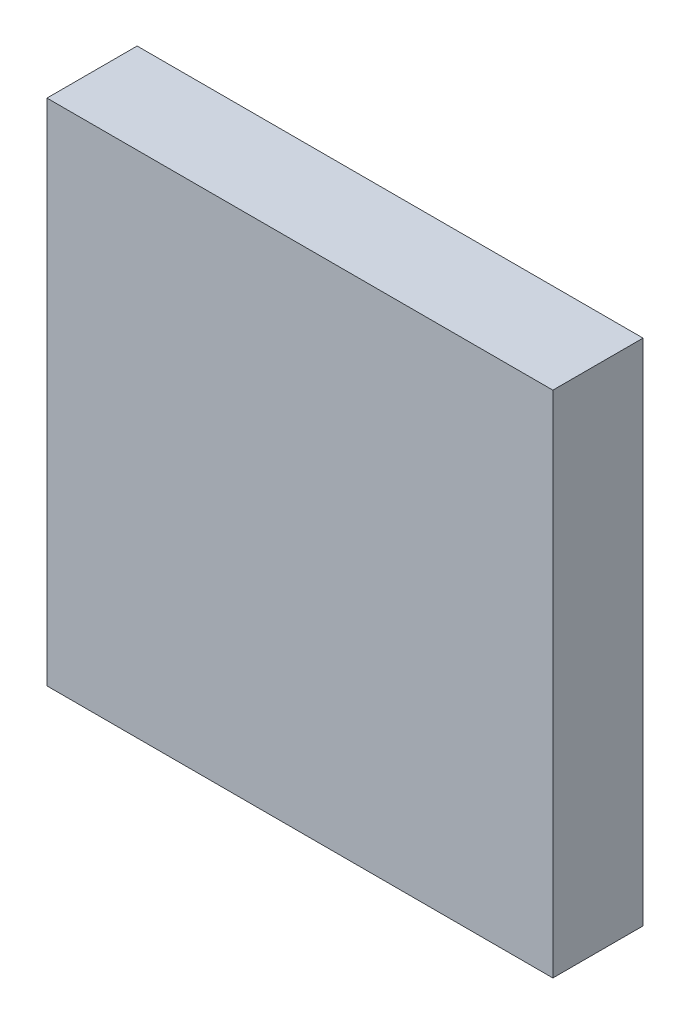
ISO-10303-21;
HEADER;
FILE_DESCRIPTION(('STEP AP214'),'2;1');
FILE_NAME('part.step','',(''),(''),'','','');
FILE_SCHEMA(('AUTOMOTIVE_DESIGN { 1 0 10303 214 1 1 1 1 }'));
ENDSEC;
DATA;
#1=APPLICATION_CONTEXT('core data for automotive mechanical design processes');
#2=APPLICATION_PROTOCOL_DEFINITION('international standard','automotive_design',2000,#1);
#3=PRODUCT_CONTEXT('',#1,'mechanical');
#4=PRODUCT('Part','Part','',(#3));
#5=PRODUCT_RELATED_PRODUCT_CATEGORY('part','',(#4));
#6=PRODUCT_DEFINITION_FORMATION('','',#4);
#7=PRODUCT_DEFINITION_CONTEXT('part definition',#1,'design');
#8=PRODUCT_DEFINITION('design','',#6,#7);
#9=PRODUCT_DEFINITION_SHAPE('','',#8);
#10=(LENGTH_UNIT() NAMED_UNIT(*) SI_UNIT(.MILLI.,.METRE.));
#11=(NAMED_UNIT(*) PLANE_ANGLE_UNIT() SI_UNIT($,.RADIAN.));
#12=(NAMED_UNIT(*) SI_UNIT($,.STERADIAN.) SOLID_ANGLE_UNIT());
#13=UNCERTAINTY_MEASURE_WITH_UNIT(LENGTH_MEASURE(1.E-05),#10,'distance_accuracy_value','');
#14=(GEOMETRIC_REPRESENTATION_CONTEXT(3) GLOBAL_UNCERTAINTY_ASSIGNED_CONTEXT((#13)) GLOBAL_UNIT_ASSIGNED_CONTEXT((#10,
#11,#12)) REPRESENTATION_CONTEXT('',''));
#15=CARTESIAN_POINT('',(0.,0.,0.));
#16=DIRECTION('',(0.,0.,1.));
#17=DIRECTION('',(1.,0.,0.));
#18=AXIS2_PLACEMENT_3D('',#15,#16,#17);
#19=CARTESIAN_POINT('',(0.,0.,10.));
#20=DIRECTION('',(1.,0.,0.));
#21=DIRECTION('',(0.,0.,-1.));
#22=AXIS2_PLACEMENT_3D('',#19,#20,#21);
#23=PLANE('',#22);
#24=DIRECTION('',(0.,-1.,0.));
#25=VECTOR('',#24,1.);
#26=CARTESIAN_POINT('',(0.,0.,0.));
#27=LINE('',#26,#25);
#28=CARTESIAN_POINT('',(0.,56.458756210382,0.));
#29=VERTEX_POINT('',#28);
#30=CARTESIAN_POINT('',(0.,0.,0.));
#31=VERTEX_POINT('',#30);
#32=EDGE_CURVE('E100',#29,#31,#27,.T.);
#33=ORIENTED_EDGE('',*,*,#32,.T.);
#34=DIRECTION('',(0.,0.,-1.));
#35=VECTOR('',#34,1.);
#36=CARTESIAN_POINT('',(0.,0.,10.));
#37=LINE('',#36,#35);
#38=CARTESIAN_POINT('',(0.,0.,10.));
#39=VERTEX_POINT('',#38);
#40=EDGE_CURVE('E11',#39,#31,#37,.T.);
#41=ORIENTED_EDGE('',*,*,#40,.F.);
#42=DIRECTION('',(0.,-1.,0.));
#43=VECTOR('',#42,1.);
#44=CARTESIAN_POINT('',(0.,0.,10.));
#45=LINE('',#44,#43);
#46=CARTESIAN_POINT('',(0.,56.458756210382,10.));
#47=VERTEX_POINT('',#46);
#48=EDGE_CURVE('E88',#47,#39,#45,.T.);
#49=ORIENTED_EDGE('',*,*,#48,.F.);
#50=DIRECTION('',(0.,0.,-1.));
#51=VECTOR('',#50,1.);
#52=CARTESIAN_POINT('',(0.,56.458756210382,10.));
#53=LINE('',#52,#51);
#54=EDGE_CURVE('E96',#47,#29,#53,.T.);
#55=ORIENTED_EDGE('',*,*,#54,.T.);
#56=EDGE_LOOP('',(#33,#41,#49,#55));
#57=FACE_BOUND('',#56,.T.);
#58=ADVANCED_FACE('F37',(#57),#23,.F.);
#59=CARTESIAN_POINT('',(0.,0.,10.));
#60=DIRECTION('',(0.,1.,0.));
#61=DIRECTION('',(0.,0.,1.));
#62=AXIS2_PLACEMENT_3D('',#59,#60,#61);
#63=PLANE('',#62);
#64=DIRECTION('',(1.,0.,0.));
#65=VECTOR('',#64,1.);
#66=CARTESIAN_POINT('',(0.,0.,0.));
#67=LINE('',#66,#65);
#68=CARTESIAN_POINT('',(56.1036696933356,0.,0.));
#69=VERTEX_POINT('',#68);
#70=EDGE_CURVE('E92',#31,#69,#67,.T.);
#71=ORIENTED_EDGE('',*,*,#70,.T.);
#72=DIRECTION('',(0.,0.,-1.));
#73=VECTOR('',#72,1.);
#74=CARTESIAN_POINT('',(56.1036696933356,0.,10.));
#75=LINE('',#74,#73);
#76=CARTESIAN_POINT('',(56.1036696933356,0.,10.));
#77=VERTEX_POINT('',#76);
#78=EDGE_CURVE('E45',#77,#69,#75,.T.);
#79=ORIENTED_EDGE('',*,*,#78,.F.);
#80=DIRECTION('',(1.,0.,0.));
#81=VECTOR('',#80,1.);
#82=CARTESIAN_POINT('',(0.,0.,10.));
#83=LINE('',#82,#81);
#84=EDGE_CURVE('E83',#39,#77,#83,.T.);
#85=ORIENTED_EDGE('',*,*,#84,.F.);
#86=ORIENTED_EDGE('',*,*,#40,.T.);
#87=EDGE_LOOP('',(#71,#79,#85,#86));
#88=FACE_BOUND('',#87,.T.);
#89=ADVANCED_FACE('F91',(#88),#63,.F.);
#90=CARTESIAN_POINT('',(56.1036696933356,0.,10.));
#91=DIRECTION('',(-1.,0.,0.));
#92=DIRECTION('',(0.,0.,1.));
#93=AXIS2_PLACEMENT_3D('',#90,#91,#92);
#94=PLANE('',#93);
#95=DIRECTION('',(0.,1.,0.));
#96=VECTOR('',#95,1.);
#97=CARTESIAN_POINT('',(56.1036696933356,0.,0.));
#98=LINE('',#97,#96);
#99=CARTESIAN_POINT('',(56.1036696933356,56.458756210382,0.));
#100=VERTEX_POINT('',#99);
#101=EDGE_CURVE('E70',#69,#100,#98,.T.);
#102=ORIENTED_EDGE('',*,*,#101,.T.);
#103=DIRECTION('',(0.,0.,-1.));
#104=VECTOR('',#103,1.);
#105=CARTESIAN_POINT('',(56.1036696933356,56.458756210382,10.));
#106=LINE('',#105,#104);
#107=CARTESIAN_POINT('',(56.1036696933356,56.458756210382,10.));
#108=VERTEX_POINT('',#107);
#109=EDGE_CURVE('E93',#108,#100,#106,.T.);
#110=ORIENTED_EDGE('',*,*,#109,.F.);
#111=DIRECTION('',(0.,1.,0.));
#112=VECTOR('',#111,1.);
#113=CARTESIAN_POINT('',(56.1036696933356,0.,10.));
#114=LINE('',#113,#112);
#115=EDGE_CURVE('E86',#77,#108,#114,.T.);
#116=ORIENTED_EDGE('',*,*,#115,.F.);
#117=ORIENTED_EDGE('',*,*,#78,.T.);
#118=EDGE_LOOP('',(#102,#110,#116,#117));
#119=FACE_BOUND('',#118,.T.);
#120=ADVANCED_FACE('F94',(#119),#94,.F.);
#121=CARTESIAN_POINT('',(0.,56.458756210382,10.));
#122=DIRECTION('',(0.,-1.,0.));
#123=DIRECTION('',(0.,0.,-1.));
#124=AXIS2_PLACEMENT_3D('',#121,#122,#123);
#125=PLANE('',#124);
#126=DIRECTION('',(-1.,0.,0.));
#127=VECTOR('',#126,1.);
#128=CARTESIAN_POINT('',(0.,56.458756210382,0.));
#129=LINE('',#128,#127);
#130=EDGE_CURVE('E76',#100,#29,#129,.T.);
#131=ORIENTED_EDGE('',*,*,#130,.T.);
#132=ORIENTED_EDGE('',*,*,#54,.F.);
#133=DIRECTION('',(-1.,0.,0.));
#134=VECTOR('',#133,1.);
#135=CARTESIAN_POINT('',(0.,56.458756210382,10.));
#136=LINE('',#135,#134);
#137=EDGE_CURVE('E53',#108,#47,#136,.T.);
#138=ORIENTED_EDGE('',*,*,#137,.F.);
#139=ORIENTED_EDGE('',*,*,#109,.T.);
#140=EDGE_LOOP('',(#131,#132,#138,#139));
#141=FACE_BOUND('',#140,.T.);
#142=ADVANCED_FACE('F107',(#141),#125,.F.);
#143=CARTESIAN_POINT('',(0.,56.458756210382,10.));
#144=DIRECTION('',(0.,0.,-1.));
#145=DIRECTION('',(-1.,0.,0.));
#146=AXIS2_PLACEMENT_3D('',#143,#144,#145);
#147=PLANE('',#146);
#148=ORIENTED_EDGE('',*,*,#48,.T.);
#149=ORIENTED_EDGE('',*,*,#84,.T.);
#150=ORIENTED_EDGE('',*,*,#115,.T.);
#151=ORIENTED_EDGE('',*,*,#137,.T.);
#152=EDGE_LOOP('',(#148,#149,#150,#151));
#153=FACE_BOUND('',#152,.T.);
#154=ADVANCED_FACE('F84',(#153),#147,.F.);
#155=CARTESIAN_POINT('',(0.,56.458756210382,0.));
#156=DIRECTION('',(0.,0.,-1.));
#157=DIRECTION('',(-1.,0.,0.));
#158=AXIS2_PLACEMENT_3D('',#155,#156,#157);
#159=PLANE('',#158);
#160=ORIENTED_EDGE('',*,*,#32,.F.);
#161=ORIENTED_EDGE('',*,*,#130,.F.);
#162=ORIENTED_EDGE('',*,*,#101,.F.);
#163=ORIENTED_EDGE('',*,*,#70,.F.);
#164=EDGE_LOOP('',(#160,#161,#162,#163));
#165=FACE_BOUND('',#164,.T.);
#166=ADVANCED_FACE('F110',(#165),#159,.T.);
#167=CLOSED_SHELL('',(#58,#89,#120,#142,#154,#166));
#168=MANIFOLD_SOLID_BREP('B2',#167);
#169=ADVANCED_BREP_SHAPE_REPRESENTATION('',(#18,#168),#14);
#170=SHAPE_DEFINITION_REPRESENTATION(#9,#169);
ENDSEC;
END-ISO-10303-21;
